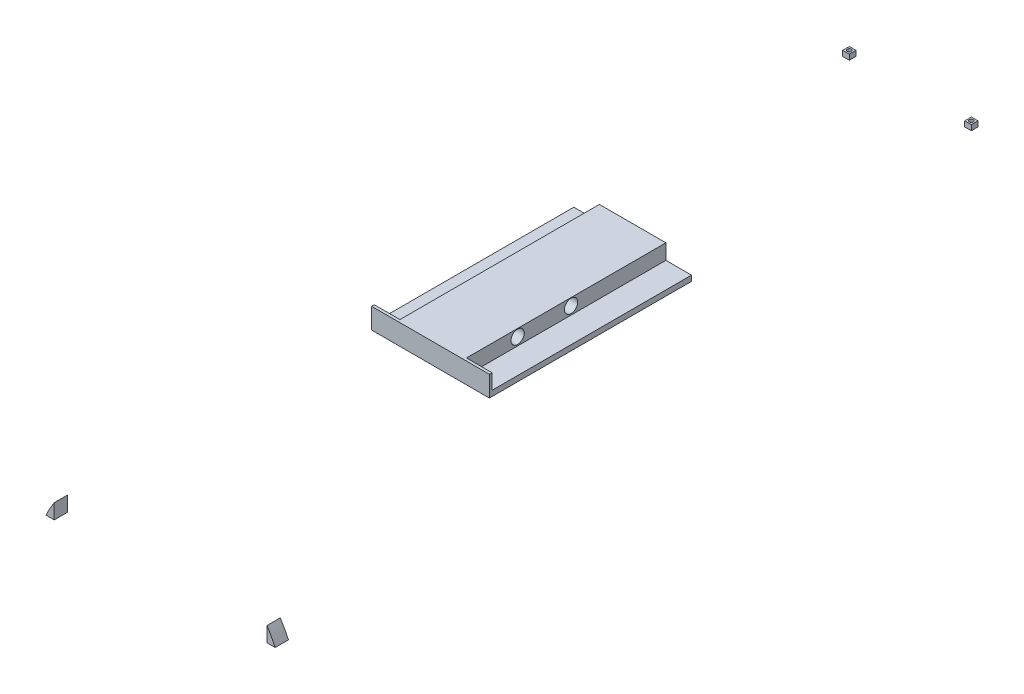
ISO-10303-21;
HEADER;
FILE_DESCRIPTION(('STEP AP214'),'2;1');
FILE_NAME('part.step','',(''),(''),'','','');
FILE_SCHEMA(('AUTOMOTIVE_DESIGN { 1 0 10303 214 1 1 1 1 }'));
ENDSEC;
DATA;
#1=APPLICATION_CONTEXT('core data for automotive mechanical design processes');
#2=APPLICATION_PROTOCOL_DEFINITION('international standard','automotive_design',2000,#1);
#3=PRODUCT_CONTEXT('',#1,'mechanical');
#4=PRODUCT('Part','Part','',(#3));
#5=PRODUCT_RELATED_PRODUCT_CATEGORY('part','',(#4));
#6=PRODUCT_DEFINITION_FORMATION('','',#4);
#7=PRODUCT_DEFINITION_CONTEXT('part definition',#1,'design');
#8=PRODUCT_DEFINITION('design','',#6,#7);
#9=PRODUCT_DEFINITION_SHAPE('','',#8);
#10=(LENGTH_UNIT() NAMED_UNIT(*) SI_UNIT(.MILLI.,.METRE.));
#11=(NAMED_UNIT(*) PLANE_ANGLE_UNIT() SI_UNIT($,.RADIAN.));
#12=(NAMED_UNIT(*) SI_UNIT($,.STERADIAN.) SOLID_ANGLE_UNIT());
#13=UNCERTAINTY_MEASURE_WITH_UNIT(LENGTH_MEASURE(1.E-05),#10,'distance_accuracy_value','');
#14=(GEOMETRIC_REPRESENTATION_CONTEXT(3) GLOBAL_UNCERTAINTY_ASSIGNED_CONTEXT((#13)) GLOBAL_UNIT_ASSIGNED_CONTEXT((#10,
#11,#12)) REPRESENTATION_CONTEXT('',''));
#15=CARTESIAN_POINT('',(0.,0.,0.));
#16=DIRECTION('',(0.,0.,1.));
#17=DIRECTION('',(1.,0.,0.));
#18=AXIS2_PLACEMENT_3D('',#15,#16,#17);
#19=CARTESIAN_POINT('',(-44.2539493265855,95.5,-575.));
#20=DIRECTION('',(1.,0.,0.));
#21=DIRECTION('',(0.,1.,0.));
#22=AXIS2_PLACEMENT_3D('',#19,#20,#21);
#23=PLANE('',#22);
#24=DIRECTION('',(0.,0.,1.));
#25=VECTOR('',#24,1.);
#26=CARTESIAN_POINT('',(-44.2539493265855,95.5,-575.));
#27=LINE('',#26,#25);
#28=CARTESIAN_POINT('',(-44.2539493265855,95.5,-425.));
#29=VERTEX_POINT('',#28);
#30=CARTESIAN_POINT('',(-44.2539493265855,95.5,-423.));
#31=VERTEX_POINT('',#30);
#32=EDGE_CURVE('P0_E184',#29,#31,#27,.T.);
#33=ORIENTED_EDGE('',*,*,#32,.F.);
#34=DIRECTION('',(0.,-1.,0.));
#35=VECTOR('',#34,1.);
#36=CARTESIAN_POINT('',(-44.2539493265855,95.5,-425.));
#37=LINE('',#36,#35);
#38=CARTESIAN_POINT('',(-44.2539493265855,84.063,-425.));
#39=VERTEX_POINT('',#38);
#40=EDGE_CURVE('P0_E72',#29,#39,#37,.T.);
#41=ORIENTED_EDGE('',*,*,#40,.T.);
#42=DIRECTION('',(0.,0.,1.));
#43=VECTOR('',#42,1.);
#44=CARTESIAN_POINT('',(-44.2539493265855,84.063,-575.));
#45=LINE('',#44,#43);
#46=CARTESIAN_POINT('',(-44.2539493265855,84.063,-575.));
#47=VERTEX_POINT('',#46);
#48=EDGE_CURVE('P0_E132',#47,#39,#45,.T.);
#49=ORIENTED_EDGE('',*,*,#48,.F.);
#50=DIRECTION('',(0.,-1.,0.));
#51=VECTOR('',#50,1.);
#52=CARTESIAN_POINT('',(-44.2539493265855,95.5,-575.));
#53=LINE('',#52,#51);
#54=CARTESIAN_POINT('',(-44.2539493265855,80.,-575.));
#55=VERTEX_POINT('',#54);
#56=EDGE_CURVE('P0_E194',#47,#55,#53,.T.);
#57=ORIENTED_EDGE('',*,*,#56,.T.);
#58=DIRECTION('',(0.,0.,-1.));
#59=VECTOR('',#58,1.);
#60=CARTESIAN_POINT('',(-44.2539493265855,80.,-423.));
#61=LINE('',#60,#59);
#62=CARTESIAN_POINT('',(-44.2539493265855,80.,-423.));
#63=VERTEX_POINT('',#62);
#64=EDGE_CURVE('P0_E167',#63,#55,#61,.T.);
#65=ORIENTED_EDGE('',*,*,#64,.F.);
#66=DIRECTION('',(0.,-1.,0.));
#67=VECTOR('',#66,1.);
#68=CARTESIAN_POINT('',(-44.2539493265855,95.5,-423.));
#69=LINE('',#68,#67);
#70=EDGE_CURVE('P0_E181',#31,#63,#69,.T.);
#71=ORIENTED_EDGE('',*,*,#70,.F.);
#72=EDGE_LOOP('',(#33,#41,#49,#57,#65,#71));
#73=FACE_BOUND('',#72,.T.);
#74=ADVANCED_FACE('P0_F48',(#73),#23,.F.);
#75=CARTESIAN_POINT('',(44.2539493265855,95.5,-425.));
#76=DIRECTION('',(-1.,0.,0.));
#77=DIRECTION('',(0.,-1.,0.));
#78=AXIS2_PLACEMENT_3D('',#75,#76,#77);
#79=PLANE('',#78);
#80=DIRECTION('',(0.,0.,-1.));
#81=VECTOR('',#80,1.);
#82=CARTESIAN_POINT('',(44.2539493265855,84.063,-425.));
#83=LINE('',#82,#81);
#84=CARTESIAN_POINT('',(44.2539493265855,84.063,-425.));
#85=VERTEX_POINT('',#84);
#86=CARTESIAN_POINT('',(44.2539493265855,84.063,-575.));
#87=VERTEX_POINT('',#86);
#88=EDGE_CURVE('P0_E164',#85,#87,#83,.T.);
#89=ORIENTED_EDGE('',*,*,#88,.F.);
#90=DIRECTION('',(0.,1.,0.));
#91=VECTOR('',#90,1.);
#92=CARTESIAN_POINT('',(44.2539493265855,95.5,-425.));
#93=LINE('',#92,#91);
#94=CARTESIAN_POINT('',(44.2539493265855,95.5,-425.));
#95=VERTEX_POINT('',#94);
#96=EDGE_CURVE('P0_E149',#85,#95,#93,.T.);
#97=ORIENTED_EDGE('',*,*,#96,.T.);
#98=DIRECTION('',(0.,0.,-1.));
#99=VECTOR('',#98,1.);
#100=CARTESIAN_POINT('',(44.2539493265855,95.5,-425.));
#101=LINE('',#100,#99);
#102=CARTESIAN_POINT('',(44.2539493265855,95.5,-423.));
#103=VERTEX_POINT('',#102);
#104=EDGE_CURVE('P0_E188',#103,#95,#101,.T.);
#105=ORIENTED_EDGE('',*,*,#104,.F.);
#106=DIRECTION('',(0.,-1.,0.));
#107=VECTOR('',#106,1.);
#108=CARTESIAN_POINT('',(44.2539493265855,95.5,-423.));
#109=LINE('',#108,#107);
#110=CARTESIAN_POINT('',(44.2539493265855,80.,-423.));
#111=VERTEX_POINT('',#110);
#112=EDGE_CURVE('P0_E180',#103,#111,#109,.T.);
#113=ORIENTED_EDGE('',*,*,#112,.T.);
#114=DIRECTION('',(0.,0.,1.));
#115=VECTOR('',#114,1.);
#116=CARTESIAN_POINT('',(44.2539493265855,80.,-577.));
#117=LINE('',#116,#115);
#118=CARTESIAN_POINT('',(44.2539493265855,80.,-575.));
#119=VERTEX_POINT('',#118);
#120=EDGE_CURVE('P0_E170',#119,#111,#117,.T.);
#121=ORIENTED_EDGE('',*,*,#120,.F.);
#122=DIRECTION('',(0.,-1.,0.));
#123=VECTOR('',#122,1.);
#124=CARTESIAN_POINT('',(44.2539493265855,95.5,-575.));
#125=LINE('',#124,#123);
#126=EDGE_CURVE('P0_E196',#87,#119,#125,.T.);
#127=ORIENTED_EDGE('',*,*,#126,.F.);
#128=EDGE_LOOP('',(#89,#97,#105,#113,#121,#127));
#129=FACE_BOUND('',#128,.T.);
#130=ADVANCED_FACE('P0_F235',(#129),#79,.F.);
#131=CARTESIAN_POINT('',(-30.,95.5,-575.));
#132=DIRECTION('',(0.,0.,1.));
#133=DIRECTION('',(1.,0.,0.));
#134=AXIS2_PLACEMENT_3D('',#131,#132,#133);
#135=PLANE('',#134);
#136=DIRECTION('',(-1.,0.,0.));
#137=VECTOR('',#136,1.);
#138=CARTESIAN_POINT('',(-25.,84.063,-575.));
#139=LINE('',#138,#137);
#140=CARTESIAN_POINT('',(-25.,84.063,-575.));
#141=VERTEX_POINT('',#140);
#142=EDGE_CURVE('P0_E141',#141,#47,#139,.T.);
#143=ORIENTED_EDGE('',*,*,#142,.F.);
#144=DIRECTION('',(0.,1.,0.));
#145=VECTOR('',#144,1.);
#146=CARTESIAN_POINT('',(-25.,84.063,-575.));
#147=LINE('',#146,#145);
#148=CARTESIAN_POINT('',(-25.,95.5,-575.));
#149=VERTEX_POINT('',#148);
#150=EDGE_CURVE('P0_E140',#141,#149,#147,.T.);
#151=ORIENTED_EDGE('',*,*,#150,.T.);
#152=DIRECTION('',(-1.,0.,0.));
#153=VECTOR('',#152,1.);
#154=CARTESIAN_POINT('',(44.2539493265855,95.5,-575.));
#155=LINE('',#154,#153);
#156=CARTESIAN_POINT('',(25.,95.5,-575.));
#157=VERTEX_POINT('',#156);
#158=EDGE_CURVE('P0_E191',#157,#149,#155,.T.);
#159=ORIENTED_EDGE('',*,*,#158,.F.);
#160=DIRECTION('',(0.,1.,0.));
#161=VECTOR('',#160,1.);
#162=CARTESIAN_POINT('',(25.,84.063,-575.));
#163=LINE('',#162,#161);
#164=CARTESIAN_POINT('',(25.,84.063,-575.));
#165=VERTEX_POINT('',#164);
#166=EDGE_CURVE('P0_E151',#165,#157,#163,.T.);
#167=ORIENTED_EDGE('',*,*,#166,.F.);
#168=DIRECTION('',(-1.,0.,0.));
#169=VECTOR('',#168,1.);
#170=CARTESIAN_POINT('',(60.,84.063,-575.));
#171=LINE('',#170,#169);
#172=EDGE_CURVE('P0_E157',#87,#165,#171,.T.);
#173=ORIENTED_EDGE('',*,*,#172,.F.);
#174=ORIENTED_EDGE('',*,*,#126,.T.);
#175=DIRECTION('',(1.,0.,0.));
#176=VECTOR('',#175,1.);
#177=CARTESIAN_POINT('',(-30.,80.,-575.));
#178=LINE('',#177,#176);
#179=EDGE_CURVE('P0_E174',#55,#119,#178,.T.);
#180=ORIENTED_EDGE('',*,*,#179,.F.);
#181=ORIENTED_EDGE('',*,*,#56,.F.);
#182=EDGE_LOOP('',(#143,#151,#159,#167,#173,#174,#180,#181));
#183=FACE_BOUND('',#182,.T.);
#184=ADVANCED_FACE('P0_F243',(#183),#135,.F.);
#185=CARTESIAN_POINT('',(44.2539493265855,95.5,-423.));
#186=DIRECTION('',(0.,0.,1.));
#187=DIRECTION('',(1.,0.,0.));
#188=AXIS2_PLACEMENT_3D('',#185,#186,#187);
#189=PLANE('',#188);
#190=ORIENTED_EDGE('',*,*,#70,.T.);
#191=DIRECTION('',(-1.,0.,0.));
#192=VECTOR('',#191,1.);
#193=CARTESIAN_POINT('',(44.2539493265855,80.,-423.));
#194=LINE('',#193,#192);
#195=EDGE_CURVE('P0_E172',#111,#63,#194,.T.);
#196=ORIENTED_EDGE('',*,*,#195,.F.);
#197=ORIENTED_EDGE('',*,*,#112,.F.);
#198=DIRECTION('',(-1.,0.,0.));
#199=VECTOR('',#198,1.);
#200=CARTESIAN_POINT('',(44.2539493265855,95.5,-423.));
#201=LINE('',#200,#199);
#202=EDGE_CURVE('P0_E177',#103,#31,#201,.T.);
#203=ORIENTED_EDGE('',*,*,#202,.T.);
#204=EDGE_LOOP('',(#190,#196,#197,#203));
#205=FACE_BOUND('',#204,.T.);
#206=ADVANCED_FACE('P0_F251',(#205),#189,.T.);
#207=CARTESIAN_POINT('',(0.,95.5,0.));
#208=DIRECTION('',(0.,1.,0.));
#209=DIRECTION('',(0.,0.,1.));
#210=AXIS2_PLACEMENT_3D('',#207,#208,#209);
#211=PLANE('',#210);
#212=DIRECTION('',(0.,0.,-1.));
#213=VECTOR('',#212,1.);
#214=CARTESIAN_POINT('',(-25.,95.5,0.));
#215=LINE('',#214,#213);
#216=CARTESIAN_POINT('',(-25.,95.5,-425.));
#217=VERTEX_POINT('',#216);
#218=EDGE_CURVE('P0_E12',#217,#149,#215,.T.);
#219=ORIENTED_EDGE('',*,*,#218,.F.);
#220=DIRECTION('',(1.,0.,0.));
#221=VECTOR('',#220,1.);
#222=CARTESIAN_POINT('',(0.,95.5,-425.));
#223=LINE('',#222,#221);
#224=EDGE_CURVE('P0_E56',#29,#217,#223,.T.);
#225=ORIENTED_EDGE('',*,*,#224,.F.);
#226=ORIENTED_EDGE('',*,*,#32,.T.);
#227=ORIENTED_EDGE('',*,*,#202,.F.);
#228=ORIENTED_EDGE('',*,*,#104,.T.);
#229=DIRECTION('',(1.,0.,0.));
#230=VECTOR('',#229,1.);
#231=CARTESIAN_POINT('',(0.,95.5,-425.));
#232=LINE('',#231,#230);
#233=CARTESIAN_POINT('',(25.,95.5,-425.));
#234=VERTEX_POINT('',#233);
#235=EDGE_CURVE('P0_E198',#234,#95,#232,.T.);
#236=ORIENTED_EDGE('',*,*,#235,.F.);
#237=DIRECTION('',(0.,0.,1.));
#238=VECTOR('',#237,1.);
#239=CARTESIAN_POINT('',(25.,95.5,0.));
#240=LINE('',#239,#238);
#241=EDGE_CURVE('P0_E200',#157,#234,#240,.T.);
#242=ORIENTED_EDGE('',*,*,#241,.F.);
#243=ORIENTED_EDGE('',*,*,#158,.T.);
#244=EDGE_LOOP('',(#219,#225,#226,#227,#228,#236,#242,#243));
#245=FACE_BOUND('',#244,.T.);
#246=ADVANCED_FACE('P0_F231',(#245),#211,.T.);
#247=CARTESIAN_POINT('',(0.,80.,0.));
#248=DIRECTION('',(0.,-1.,0.));
#249=DIRECTION('',(0.,0.,-1.));
#250=AXIS2_PLACEMENT_3D('',#247,#248,#249);
#251=PLANE('',#250);
#252=ORIENTED_EDGE('',*,*,#179,.T.);
#253=ORIENTED_EDGE('',*,*,#120,.T.);
#254=ORIENTED_EDGE('',*,*,#195,.T.);
#255=ORIENTED_EDGE('',*,*,#64,.T.);
#256=EDGE_LOOP('',(#252,#253,#254,#255));
#257=FACE_BOUND('',#256,.T.);
#258=ADVANCED_FACE('P0_F253',(#257),#251,.T.);
#259=CARTESIAN_POINT('',(0.,84.063,0.));
#260=DIRECTION('',(0.,1.,0.));
#261=DIRECTION('',(0.,0.,1.));
#262=AXIS2_PLACEMENT_3D('',#259,#260,#261);
#263=PLANE('',#262);
#264=ORIENTED_EDGE('',*,*,#88,.T.);
#265=ORIENTED_EDGE('',*,*,#172,.T.);
#266=DIRECTION('',(0.,0.,1.));
#267=VECTOR('',#266,1.);
#268=CARTESIAN_POINT('',(25.,84.063,-575.));
#269=LINE('',#268,#267);
#270=CARTESIAN_POINT('',(25.,84.063,-425.));
#271=VERTEX_POINT('',#270);
#272=EDGE_CURVE('P0_E153',#165,#271,#269,.T.);
#273=ORIENTED_EDGE('',*,*,#272,.T.);
#274=DIRECTION('',(1.,0.,0.));
#275=VECTOR('',#274,1.);
#276=CARTESIAN_POINT('',(25.,84.063,-425.));
#277=LINE('',#276,#275);
#278=EDGE_CURVE('P0_E133',#271,#85,#277,.T.);
#279=ORIENTED_EDGE('',*,*,#278,.T.);
#280=EDGE_LOOP('',(#264,#265,#273,#279));
#281=FACE_BOUND('',#280,.T.);
#282=ADVANCED_FACE('P0_F241',(#281),#263,.T.);
#283=CARTESIAN_POINT('',(44.2539493265855,84.063,-425.));
#284=DIRECTION('',(0.,0.,1.));
#285=DIRECTION('',(1.,0.,0.));
#286=AXIS2_PLACEMENT_3D('',#283,#284,#285);
#287=PLANE('',#286);
#288=ORIENTED_EDGE('',*,*,#278,.F.);
#289=DIRECTION('',(0.,1.,0.));
#290=VECTOR('',#289,1.);
#291=CARTESIAN_POINT('',(25.,84.063,-425.));
#292=LINE('',#291,#290);
#293=EDGE_CURVE('P0_E64',#271,#234,#292,.T.);
#294=ORIENTED_EDGE('',*,*,#293,.T.);
#295=ORIENTED_EDGE('',*,*,#235,.T.);
#296=ORIENTED_EDGE('',*,*,#96,.F.);
#297=EDGE_LOOP('',(#288,#294,#295,#296));
#298=FACE_BOUND('',#297,.T.);
#299=ADVANCED_FACE('P0_F222',(#298),#287,.F.);
#300=CARTESIAN_POINT('',(25.,84.063,-575.));
#301=DIRECTION('',(-1.,0.,0.));
#302=DIRECTION('',(0.,-1.,0.));
#303=AXIS2_PLACEMENT_3D('',#300,#301,#302);
#304=PLANE('',#303);
#305=CARTESIAN_POINT('',(25.,90.063,-503.700854972493));
#306=DIRECTION('',(1.,0.,0.));
#307=DIRECTION('',(0.,1.,0.));
#308=AXIS2_PLACEMENT_3D('',#305,#306,#307);
#309=CIRCLE('',#308,5.);
#310=CARTESIAN_POINT('',(25.,95.063,-503.700854972493));
#311=VERTEX_POINT('',#310);
#312=EDGE_CURVE('P0_E204',#311,#311,#309,.T.);
#313=ORIENTED_EDGE('',*,*,#312,.F.);
#314=EDGE_LOOP('',(#313));
#315=FACE_BOUND('',#314,.T.);
#316=CARTESIAN_POINT('',(25.,90.063,-463.500824114449));
#317=DIRECTION('',(1.,0.,0.));
#318=DIRECTION('',(0.,1.,0.));
#319=AXIS2_PLACEMENT_3D('',#316,#317,#318);
#320=CIRCLE('',#319,5.);
#321=CARTESIAN_POINT('',(25.,95.063,-463.500824114449));
#322=VERTEX_POINT('',#321);
#323=EDGE_CURVE('P0_E209',#322,#322,#320,.T.);
#324=ORIENTED_EDGE('',*,*,#323,.F.);
#325=EDGE_LOOP('',(#324));
#326=FACE_BOUND('',#325,.T.);
#327=ORIENTED_EDGE('',*,*,#241,.T.);
#328=ORIENTED_EDGE('',*,*,#293,.F.);
#329=ORIENTED_EDGE('',*,*,#272,.F.);
#330=ORIENTED_EDGE('',*,*,#166,.T.);
#331=EDGE_LOOP('',(#327,#328,#329,#330));
#332=FACE_BOUND('',#331,.T.);
#333=ADVANCED_FACE('P0_F219',(#315,#326,#332),#304,.F.);
#334=CARTESIAN_POINT('',(0.,84.063,0.));
#335=DIRECTION('',(0.,1.,0.));
#336=DIRECTION('',(0.,0.,1.));
#337=AXIS2_PLACEMENT_3D('',#334,#335,#336);
#338=PLANE('',#337);
#339=ORIENTED_EDGE('',*,*,#48,.T.);
#340=DIRECTION('',(1.,0.,0.));
#341=VECTOR('',#340,1.);
#342=CARTESIAN_POINT('',(-60.,84.063,-425.));
#343=LINE('',#342,#341);
#344=CARTESIAN_POINT('',(-25.,84.063,-425.));
#345=VERTEX_POINT('',#344);
#346=EDGE_CURVE('P0_E125',#39,#345,#343,.T.);
#347=ORIENTED_EDGE('',*,*,#346,.T.);
#348=DIRECTION('',(0.,0.,-1.));
#349=VECTOR('',#348,1.);
#350=CARTESIAN_POINT('',(-25.,84.063,-425.));
#351=LINE('',#350,#349);
#352=EDGE_CURVE('P0_E129',#345,#141,#351,.T.);
#353=ORIENTED_EDGE('',*,*,#352,.T.);
#354=ORIENTED_EDGE('',*,*,#142,.T.);
#355=EDGE_LOOP('',(#339,#347,#353,#354));
#356=FACE_BOUND('',#355,.T.);
#357=ADVANCED_FACE('P0_F127',(#356),#338,.T.);
#358=CARTESIAN_POINT('',(-30.,84.063,-425.));
#359=DIRECTION('',(0.,0.,1.));
#360=DIRECTION('',(1.,0.,0.));
#361=AXIS2_PLACEMENT_3D('',#358,#359,#360);
#362=PLANE('',#361);
#363=ORIENTED_EDGE('',*,*,#224,.T.);
#364=DIRECTION('',(0.,1.,0.));
#365=VECTOR('',#364,1.);
#366=CARTESIAN_POINT('',(-25.,84.063,-425.));
#367=LINE('',#366,#365);
#368=EDGE_CURVE('P0_E136',#345,#217,#367,.T.);
#369=ORIENTED_EDGE('',*,*,#368,.F.);
#370=ORIENTED_EDGE('',*,*,#346,.F.);
#371=ORIENTED_EDGE('',*,*,#40,.F.);
#372=EDGE_LOOP('',(#363,#369,#370,#371));
#373=FACE_BOUND('',#372,.T.);
#374=ADVANCED_FACE('P0_F137',(#373),#362,.F.);
#375=CARTESIAN_POINT('',(-25.,84.063,-425.));
#376=DIRECTION('',(1.,0.,0.));
#377=DIRECTION('',(0.,1.,0.));
#378=AXIS2_PLACEMENT_3D('',#375,#376,#377);
#379=PLANE('',#378);
#380=CARTESIAN_POINT('',(-25.,90.063,-503.700854972493));
#381=DIRECTION('',(1.,0.,0.));
#382=DIRECTION('',(0.,1.,0.));
#383=AXIS2_PLACEMENT_3D('',#380,#381,#382);
#384=CIRCLE('',#383,5.);
#385=CARTESIAN_POINT('',(-25.,95.063,-503.700854972493));
#386=VERTEX_POINT('',#385);
#387=EDGE_CURVE('P0_E51',#386,#386,#384,.T.);
#388=ORIENTED_EDGE('',*,*,#387,.T.);
#389=EDGE_LOOP('',(#388));
#390=FACE_BOUND('',#389,.T.);
#391=CARTESIAN_POINT('',(-25.,90.063,-463.500824114449));
#392=DIRECTION('',(1.,0.,0.));
#393=DIRECTION('',(0.,1.,0.));
#394=AXIS2_PLACEMENT_3D('',#391,#392,#393);
#395=CIRCLE('',#394,5.);
#396=CARTESIAN_POINT('',(-25.,95.063,-463.500824114449));
#397=VERTEX_POINT('',#396);
#398=EDGE_CURVE('P0_E202',#397,#397,#395,.T.);
#399=ORIENTED_EDGE('',*,*,#398,.T.);
#400=EDGE_LOOP('',(#399));
#401=FACE_BOUND('',#400,.T.);
#402=ORIENTED_EDGE('',*,*,#218,.T.);
#403=ORIENTED_EDGE('',*,*,#150,.F.);
#404=ORIENTED_EDGE('',*,*,#352,.F.);
#405=ORIENTED_EDGE('',*,*,#368,.T.);
#406=EDGE_LOOP('',(#402,#403,#404,#405));
#407=FACE_BOUND('',#406,.T.);
#408=ADVANCED_FACE('P0_F143',(#390,#401,#407),#379,.F.);
#409=CARTESIAN_POINT('',(-86.1684396980704,90.063,-463.500824114449));
#410=DIRECTION('',(1.,0.,0.));
#411=DIRECTION('',(0.,1.,0.));
#412=AXIS2_PLACEMENT_3D('',#409,#410,#411);
#413=CYLINDRICAL_SURFACE('',#412,5.);
#414=ORIENTED_EDGE('',*,*,#323,.T.);
#415=EDGE_LOOP('',(#414));
#416=FACE_BOUND('',#415,.T.);
#417=ORIENTED_EDGE('',*,*,#398,.F.);
#418=EDGE_LOOP('',(#417));
#419=FACE_BOUND('',#418,.T.);
#420=ADVANCED_FACE('P0_F216',(#416,#419),#413,.F.);
#421=CARTESIAN_POINT('',(-86.1684396980704,90.063,-503.700854972493));
#422=DIRECTION('',(1.,0.,0.));
#423=DIRECTION('',(0.,1.,0.));
#424=AXIS2_PLACEMENT_3D('',#421,#422,#423);
#425=CYLINDRICAL_SURFACE('',#424,5.);
#426=ORIENTED_EDGE('',*,*,#312,.T.);
#427=EDGE_LOOP('',(#426));
#428=FACE_BOUND('',#427,.T.);
#429=ORIENTED_EDGE('',*,*,#387,.F.);
#430=EDGE_LOOP('',(#429));
#431=FACE_BOUND('',#430,.T.);
#432=ADVANCED_FACE('P0_F343',(#428,#431),#425,.F.);
#433=CLOSED_SHELL('',(#74,#130,#184,#206,#246,#258,#282,#299,#333,#357,#374,#408,#420,#432));
#434=MANIFOLD_SOLID_BREP('P0_B2',#433);
#435=CARTESIAN_POINT('',(48.4063060876568,81.,-781.306302338996));
#436=DIRECTION('',(-1.,0.,0.));
#437=DIRECTION('',(0.,-1.,0.));
#438=AXIS2_PLACEMENT_3D('',#435,#436,#437);
#439=PLANE('',#438);
#440=DIRECTION('',(0.,0.,-1.));
#441=VECTOR('',#440,1.);
#442=CARTESIAN_POINT('',(48.4063060876568,77.,-781.306302338996));
#443=LINE('',#442,#441);
#444=CARTESIAN_POINT('',(48.4063060876568,77.,-781.306302338996));
#445=VERTEX_POINT('',#444);
#446=CARTESIAN_POINT('',(48.4063060876568,77.,-786.306302338996));
#447=VERTEX_POINT('',#446);
#448=EDGE_CURVE('P0_E46',#445,#447,#443,.T.);
#449=ORIENTED_EDGE('',*,*,#448,.T.);
#450=DIRECTION('',(0.,-1.,0.));
#451=VECTOR('',#450,1.);
#452=CARTESIAN_POINT('',(48.4063060876568,81.,-786.306302338996));
#453=LINE('',#452,#451);
#454=CARTESIAN_POINT('',(48.4063060876568,81.,-786.306302338996));
#455=VERTEX_POINT('',#454);
#456=EDGE_CURVE('P0_E481',#455,#447,#453,.T.);
#457=ORIENTED_EDGE('',*,*,#456,.F.);
#458=DIRECTION('',(0.,0.,-1.));
#459=VECTOR('',#458,1.);
#460=CARTESIAN_POINT('',(48.4063060876568,81.,-781.306302338996));
#461=LINE('',#460,#459);
#462=CARTESIAN_POINT('',(48.4063060876568,81.,-781.306302338996));
#463=VERTEX_POINT('',#462);
#464=EDGE_CURVE('P0_E470',#463,#455,#461,.T.);
#465=ORIENTED_EDGE('',*,*,#464,.F.);
#466=DIRECTION('',(0.,-1.,0.));
#467=VECTOR('',#466,1.);
#468=CARTESIAN_POINT('',(48.4063060876568,81.,-781.306302338996));
#469=LINE('',#468,#467);
#470=EDGE_CURVE('P0_E467',#463,#445,#469,.T.);
#471=ORIENTED_EDGE('',*,*,#470,.T.);
#472=EDGE_LOOP('',(#449,#457,#465,#471));
#473=FACE_BOUND('',#472,.T.);
#474=ADVANCED_FACE('P0_F408',(#473),#439,.F.);
#475=CARTESIAN_POINT('',(48.4063060876568,81.,-786.306302338996));
#476=DIRECTION('',(0.,0.,1.));
#477=DIRECTION('',(1.,0.,0.));
#478=AXIS2_PLACEMENT_3D('',#475,#476,#477);
#479=PLANE('',#478);
#480=DIRECTION('',(-1.,0.,0.));
#481=VECTOR('',#480,1.);
#482=CARTESIAN_POINT('',(48.4063060876568,77.,-786.306302338996));
#483=LINE('',#482,#481);
#484=CARTESIAN_POINT('',(43.4063060876568,77.,-786.306302338996));
#485=VERTEX_POINT('',#484);
#486=EDGE_CURVE('P0_E418',#447,#485,#483,.T.);
#487=ORIENTED_EDGE('',*,*,#486,.T.);
#488=DIRECTION('',(0.,-1.,0.));
#489=VECTOR('',#488,1.);
#490=CARTESIAN_POINT('',(43.4063060876568,81.,-786.306302338996));
#491=LINE('',#490,#489);
#492=CARTESIAN_POINT('',(43.4063060876568,81.,-786.306302338996));
#493=VERTEX_POINT('',#492);
#494=EDGE_CURVE('P0_E463',#493,#485,#491,.T.);
#495=ORIENTED_EDGE('',*,*,#494,.F.);
#496=DIRECTION('',(-1.,0.,0.));
#497=VECTOR('',#496,1.);
#498=CARTESIAN_POINT('',(48.4063060876568,81.,-786.306302338996));
#499=LINE('',#498,#497);
#500=EDGE_CURVE('P0_E442',#455,#493,#499,.T.);
#501=ORIENTED_EDGE('',*,*,#500,.F.);
#502=ORIENTED_EDGE('',*,*,#456,.T.);
#503=EDGE_LOOP('',(#487,#495,#501,#502));
#504=FACE_BOUND('',#503,.T.);
#505=ADVANCED_FACE('P0_F503',(#504),#479,.F.);
#506=CARTESIAN_POINT('',(43.4063060876568,81.,-786.306302338996));
#507=DIRECTION('',(1.,0.,0.));
#508=DIRECTION('',(0.,1.,0.));
#509=AXIS2_PLACEMENT_3D('',#506,#507,#508);
#510=PLANE('',#509);
#511=DIRECTION('',(0.,0.,1.));
#512=VECTOR('',#511,1.);
#513=CARTESIAN_POINT('',(43.4063060876568,77.,-786.306302338996));
#514=LINE('',#513,#512);
#515=CARTESIAN_POINT('',(43.4063060876568,77.,-781.306302338996));
#516=VERTEX_POINT('',#515);
#517=EDGE_CURVE('P0_E458',#485,#516,#514,.T.);
#518=ORIENTED_EDGE('',*,*,#517,.T.);
#519=DIRECTION('',(0.,-1.,0.));
#520=VECTOR('',#519,1.);
#521=CARTESIAN_POINT('',(43.4063060876568,81.,-781.306302338996));
#522=LINE('',#521,#520);
#523=CARTESIAN_POINT('',(43.4063060876568,81.,-781.306302338996));
#524=VERTEX_POINT('',#523);
#525=EDGE_CURVE('P0_E461',#524,#516,#522,.T.);
#526=ORIENTED_EDGE('',*,*,#525,.F.);
#527=DIRECTION('',(0.,0.,1.));
#528=VECTOR('',#527,1.);
#529=CARTESIAN_POINT('',(43.4063060876568,81.,-786.306302338996));
#530=LINE('',#529,#528);
#531=EDGE_CURVE('P0_E476',#493,#524,#530,.T.);
#532=ORIENTED_EDGE('',*,*,#531,.F.);
#533=ORIENTED_EDGE('',*,*,#494,.T.);
#534=EDGE_LOOP('',(#518,#526,#532,#533));
#535=FACE_BOUND('',#534,.T.);
#536=ADVANCED_FACE('P0_F459',(#535),#510,.F.);
#537=CARTESIAN_POINT('',(43.4063060876568,81.,-781.306302338996));
#538=DIRECTION('',(0.,0.,-1.));
#539=DIRECTION('',(-1.,0.,0.));
#540=AXIS2_PLACEMENT_3D('',#537,#538,#539);
#541=PLANE('',#540);
#542=DIRECTION('',(1.,0.,0.));
#543=VECTOR('',#542,1.);
#544=CARTESIAN_POINT('',(43.4063060876568,77.,-781.306302338996));
#545=LINE('',#544,#543);
#546=EDGE_CURVE('P0_E452',#516,#445,#545,.T.);
#547=ORIENTED_EDGE('',*,*,#546,.T.);
#548=ORIENTED_EDGE('',*,*,#470,.F.);
#549=DIRECTION('',(1.,0.,0.));
#550=VECTOR('',#549,1.);
#551=CARTESIAN_POINT('',(43.4063060876568,81.,-781.306302338996));
#552=LINE('',#551,#550);
#553=EDGE_CURVE('P0_E466',#524,#463,#552,.T.);
#554=ORIENTED_EDGE('',*,*,#553,.F.);
#555=ORIENTED_EDGE('',*,*,#525,.T.);
#556=EDGE_LOOP('',(#547,#548,#554,#555));
#557=FACE_BOUND('',#556,.T.);
#558=ADVANCED_FACE('P0_F465',(#557),#541,.F.);
#559=CARTESIAN_POINT('',(0.,81.,0.));
#560=DIRECTION('',(0.,1.,0.));
#561=DIRECTION('',(0.,0.,1.));
#562=AXIS2_PLACEMENT_3D('',#559,#560,#561);
#563=PLANE('',#562);
#564=CARTESIAN_POINT('',(45.9063060876568,81.,-783.806302338996));
#565=DIRECTION('',(0.,-1.,0.));
#566=DIRECTION('',(0.,0.,-1.));
#567=AXIS2_PLACEMENT_3D('',#564,#565,#566);
#568=CIRCLE('',#567,1.49999999999998);
#569=CARTESIAN_POINT('',(45.9063060876568,81.,-785.306302338996));
#570=VERTEX_POINT('',#569);
#571=EDGE_CURVE('P0_E485',#570,#570,#568,.T.);
#572=ORIENTED_EDGE('',*,*,#571,.T.);
#573=EDGE_LOOP('',(#572));
#574=FACE_BOUND('',#573,.T.);
#575=ORIENTED_EDGE('',*,*,#464,.T.);
#576=ORIENTED_EDGE('',*,*,#500,.T.);
#577=ORIENTED_EDGE('',*,*,#531,.T.);
#578=ORIENTED_EDGE('',*,*,#553,.T.);
#579=EDGE_LOOP('',(#575,#576,#577,#578));
#580=FACE_BOUND('',#579,.T.);
#581=ADVANCED_FACE('P0_F410',(#574,#580),#563,.T.);
#582=CARTESIAN_POINT('',(0.,77.,0.));
#583=DIRECTION('',(0.,1.,0.));
#584=DIRECTION('',(0.,0.,1.));
#585=AXIS2_PLACEMENT_3D('',#582,#583,#584);
#586=PLANE('',#585);
#587=CARTESIAN_POINT('',(45.9063060876568,77.,-783.806302338996));
#588=DIRECTION('',(0.,1.,0.));
#589=DIRECTION('',(0.,0.,1.));
#590=AXIS2_PLACEMENT_3D('',#587,#588,#589);
#591=CIRCLE('',#590,1.49999999999998);
#592=CARTESIAN_POINT('',(45.9063060876568,77.,-782.306302338996));
#593=VERTEX_POINT('',#592);
#594=EDGE_CURVE('P0_E412',#593,#593,#591,.T.);
#595=ORIENTED_EDGE('',*,*,#594,.T.);
#596=EDGE_LOOP('',(#595));
#597=FACE_BOUND('',#596,.T.);
#598=ORIENTED_EDGE('',*,*,#448,.F.);
#599=ORIENTED_EDGE('',*,*,#546,.F.);
#600=ORIENTED_EDGE('',*,*,#517,.F.);
#601=ORIENTED_EDGE('',*,*,#486,.F.);
#602=EDGE_LOOP('',(#598,#599,#600,#601));
#603=FACE_BOUND('',#602,.T.);
#604=ADVANCED_FACE('P0_F469',(#597,#603),#586,.F.);
#605=CARTESIAN_POINT('',(45.9063060876568,81.,-783.806302338996));
#606=DIRECTION('',(0.,-1.,0.));
#607=DIRECTION('',(0.,0.,-1.));
#608=AXIS2_PLACEMENT_3D('',#605,#606,#607);
#609=CYLINDRICAL_SURFACE('',#608,1.49999999999998);
#610=ORIENTED_EDGE('',*,*,#571,.F.);
#611=EDGE_LOOP('',(#610));
#612=FACE_BOUND('',#611,.T.);
#613=ORIENTED_EDGE('',*,*,#594,.F.);
#614=EDGE_LOOP('',(#613));
#615=FACE_BOUND('',#614,.T.);
#616=ADVANCED_FACE('P0_F491',(#612,#615),#609,.F.);
#617=CLOSED_SHELL('',(#474,#505,#536,#558,#581,#604,#616));
#618=MANIFOLD_SOLID_BREP('P0_B6',#617);
#619=CARTESIAN_POINT('',(-43.4063060876568,81.,-781.306302338996));
#620=DIRECTION('',(-1.,0.,0.));
#621=DIRECTION('',(0.,-1.,0.));
#622=AXIS2_PLACEMENT_3D('',#619,#620,#621);
#623=PLANE('',#622);
#624=DIRECTION('',(0.,0.,-1.));
#625=VECTOR('',#624,1.);
#626=CARTESIAN_POINT('',(-43.4063060876568,77.,-781.306302338996));
#627=LINE('',#626,#625);
#628=CARTESIAN_POINT('',(-43.4063060876568,77.,-781.306302338996));
#629=VERTEX_POINT('',#628);
#630=CARTESIAN_POINT('',(-43.4063060876568,77.,-786.306302338996));
#631=VERTEX_POINT('',#630);
#632=EDGE_CURVE('P0_E618',#629,#631,#627,.T.);
#633=ORIENTED_EDGE('',*,*,#632,.T.);
#634=DIRECTION('',(0.,-1.,0.));
#635=VECTOR('',#634,1.);
#636=CARTESIAN_POINT('',(-43.4063060876568,81.,-786.306302338996));
#637=LINE('',#636,#635);
#638=CARTESIAN_POINT('',(-43.4063060876568,81.,-786.306302338996));
#639=VERTEX_POINT('',#638);
#640=EDGE_CURVE('P0_E406',#639,#631,#637,.T.);
#641=ORIENTED_EDGE('',*,*,#640,.F.);
#642=DIRECTION('',(0.,0.,-1.));
#643=VECTOR('',#642,1.);
#644=CARTESIAN_POINT('',(-43.4063060876568,81.,-781.306302338996));
#645=LINE('',#644,#643);
#646=CARTESIAN_POINT('',(-43.4063060876568,81.,-781.306302338996));
#647=VERTEX_POINT('',#646);
#648=EDGE_CURVE('P0_E605',#647,#639,#645,.T.);
#649=ORIENTED_EDGE('',*,*,#648,.F.);
#650=DIRECTION('',(0.,-1.,0.));
#651=VECTOR('',#650,1.);
#652=CARTESIAN_POINT('',(-43.4063060876568,81.,-781.306302338996));
#653=LINE('',#652,#651);
#654=EDGE_CURVE('P0_E614',#647,#629,#653,.T.);
#655=ORIENTED_EDGE('',*,*,#654,.T.);
#656=EDGE_LOOP('',(#633,#641,#649,#655));
#657=FACE_BOUND('',#656,.T.);
#658=ADVANCED_FACE('P0_F553',(#657),#623,.F.);
#659=CARTESIAN_POINT('',(-43.4063060876568,81.,-786.306302338996));
#660=DIRECTION('',(0.,0.,1.));
#661=DIRECTION('',(1.,0.,0.));
#662=AXIS2_PLACEMENT_3D('',#659,#660,#661);
#663=PLANE('',#662);
#664=DIRECTION('',(-1.,0.,0.));
#665=VECTOR('',#664,1.);
#666=CARTESIAN_POINT('',(-43.4063060876568,77.,-786.306302338996));
#667=LINE('',#666,#665);
#668=CARTESIAN_POINT('',(-48.4063060876568,77.,-786.306302338996));
#669=VERTEX_POINT('',#668);
#670=EDGE_CURVE('P0_E609',#631,#669,#667,.T.);
#671=ORIENTED_EDGE('',*,*,#670,.T.);
#672=DIRECTION('',(0.,-1.,0.));
#673=VECTOR('',#672,1.);
#674=CARTESIAN_POINT('',(-48.4063060876568,81.,-786.306302338996));
#675=LINE('',#674,#673);
#676=CARTESIAN_POINT('',(-48.4063060876568,81.,-786.306302338996));
#677=VERTEX_POINT('',#676);
#678=EDGE_CURVE('P0_E562',#677,#669,#675,.T.);
#679=ORIENTED_EDGE('',*,*,#678,.F.);
#680=DIRECTION('',(-1.,0.,0.));
#681=VECTOR('',#680,1.);
#682=CARTESIAN_POINT('',(-43.4063060876568,81.,-786.306302338996));
#683=LINE('',#682,#681);
#684=EDGE_CURVE('P0_E600',#639,#677,#683,.T.);
#685=ORIENTED_EDGE('',*,*,#684,.F.);
#686=ORIENTED_EDGE('',*,*,#640,.T.);
#687=EDGE_LOOP('',(#671,#679,#685,#686));
#688=FACE_BOUND('',#687,.T.);
#689=ADVANCED_FACE('P0_F608',(#688),#663,.F.);
#690=CARTESIAN_POINT('',(-48.4063060876568,81.,-786.306302338996));
#691=DIRECTION('',(1.,0.,0.));
#692=DIRECTION('',(0.,1.,0.));
#693=AXIS2_PLACEMENT_3D('',#690,#691,#692);
#694=PLANE('',#693);
#695=DIRECTION('',(0.,0.,1.));
#696=VECTOR('',#695,1.);
#697=CARTESIAN_POINT('',(-48.4063060876568,77.,-786.306302338996));
#698=LINE('',#697,#696);
#699=CARTESIAN_POINT('',(-48.4063060876568,77.,-781.306302338996));
#700=VERTEX_POINT('',#699);
#701=EDGE_CURVE('P0_E587',#669,#700,#698,.T.);
#702=ORIENTED_EDGE('',*,*,#701,.T.);
#703=DIRECTION('',(0.,-1.,0.));
#704=VECTOR('',#703,1.);
#705=CARTESIAN_POINT('',(-48.4063060876568,81.,-781.306302338996));
#706=LINE('',#705,#704);
#707=CARTESIAN_POINT('',(-48.4063060876568,81.,-781.306302338996));
#708=VERTEX_POINT('',#707);
#709=EDGE_CURVE('P0_E610',#708,#700,#706,.T.);
#710=ORIENTED_EDGE('',*,*,#709,.F.);
#711=DIRECTION('',(0.,0.,1.));
#712=VECTOR('',#711,1.);
#713=CARTESIAN_POINT('',(-48.4063060876568,81.,-786.306302338996));
#714=LINE('',#713,#712);
#715=EDGE_CURVE('P0_E603',#677,#708,#714,.T.);
#716=ORIENTED_EDGE('',*,*,#715,.F.);
#717=ORIENTED_EDGE('',*,*,#678,.T.);
#718=EDGE_LOOP('',(#702,#710,#716,#717));
#719=FACE_BOUND('',#718,.T.);
#720=ADVANCED_FACE('P0_F612',(#719),#694,.F.);
#721=CARTESIAN_POINT('',(-48.4063060876568,81.,-781.306302338996));
#722=DIRECTION('',(0.,0.,-1.));
#723=DIRECTION('',(-1.,0.,0.));
#724=AXIS2_PLACEMENT_3D('',#721,#722,#723);
#725=PLANE('',#724);
#726=DIRECTION('',(1.,0.,0.));
#727=VECTOR('',#726,1.);
#728=CARTESIAN_POINT('',(-48.4063060876568,77.,-781.306302338996));
#729=LINE('',#728,#727);
#730=EDGE_CURVE('P0_E593',#700,#629,#729,.T.);
#731=ORIENTED_EDGE('',*,*,#730,.T.);
#732=ORIENTED_EDGE('',*,*,#654,.F.);
#733=DIRECTION('',(1.,0.,0.));
#734=VECTOR('',#733,1.);
#735=CARTESIAN_POINT('',(-48.4063060876568,81.,-781.306302338996));
#736=LINE('',#735,#734);
#737=EDGE_CURVE('P0_E570',#708,#647,#736,.T.);
#738=ORIENTED_EDGE('',*,*,#737,.F.);
#739=ORIENTED_EDGE('',*,*,#709,.T.);
#740=EDGE_LOOP('',(#731,#732,#738,#739));
#741=FACE_BOUND('',#740,.T.);
#742=ADVANCED_FACE('P0_F625',(#741),#725,.F.);
#743=CARTESIAN_POINT('',(0.,81.,0.));
#744=DIRECTION('',(0.,1.,0.));
#745=DIRECTION('',(0.,0.,1.));
#746=AXIS2_PLACEMENT_3D('',#743,#744,#745);
#747=PLANE('',#746);
#748=CARTESIAN_POINT('',(-45.9063060876568,81.,-783.806302338996));
#749=DIRECTION('',(0.,-1.,0.));
#750=DIRECTION('',(0.,0.,-1.));
#751=AXIS2_PLACEMENT_3D('',#748,#749,#750);
#752=CIRCLE('',#751,1.49999999999997);
#753=CARTESIAN_POINT('',(-45.9063060876568,81.,-785.306302338996));
#754=VERTEX_POINT('',#753);
#755=EDGE_CURVE('P0_E631',#754,#754,#752,.T.);
#756=ORIENTED_EDGE('',*,*,#755,.T.);
#757=EDGE_LOOP('',(#756));
#758=FACE_BOUND('',#757,.T.);
#759=ORIENTED_EDGE('',*,*,#648,.T.);
#760=ORIENTED_EDGE('',*,*,#684,.T.);
#761=ORIENTED_EDGE('',*,*,#715,.T.);
#762=ORIENTED_EDGE('',*,*,#737,.T.);
#763=EDGE_LOOP('',(#759,#760,#761,#762));
#764=FACE_BOUND('',#763,.T.);
#765=ADVANCED_FACE('P0_F601',(#758,#764),#747,.T.);
#766=CARTESIAN_POINT('',(0.,77.,0.));
#767=DIRECTION('',(0.,1.,0.));
#768=DIRECTION('',(0.,0.,1.));
#769=AXIS2_PLACEMENT_3D('',#766,#767,#768);
#770=PLANE('',#769);
#771=CARTESIAN_POINT('',(-45.9063060876568,77.,-783.806302338996));
#772=DIRECTION('',(0.,1.,0.));
#773=DIRECTION('',(0.,0.,1.));
#774=AXIS2_PLACEMENT_3D('',#771,#772,#773);
#775=CIRCLE('',#774,1.49999999999997);
#776=CARTESIAN_POINT('',(-45.9063060876568,77.,-782.306302338996));
#777=VERTEX_POINT('',#776);
#778=EDGE_CURVE('P0_E556',#777,#777,#775,.T.);
#779=ORIENTED_EDGE('',*,*,#778,.T.);
#780=EDGE_LOOP('',(#779));
#781=FACE_BOUND('',#780,.T.);
#782=ORIENTED_EDGE('',*,*,#632,.F.);
#783=ORIENTED_EDGE('',*,*,#730,.F.);
#784=ORIENTED_EDGE('',*,*,#701,.F.);
#785=ORIENTED_EDGE('',*,*,#670,.F.);
#786=EDGE_LOOP('',(#782,#783,#784,#785));
#787=FACE_BOUND('',#786,.T.);
#788=ADVANCED_FACE('P0_F628',(#781,#787),#770,.F.);
#789=CARTESIAN_POINT('',(-45.9063060876568,81.,-783.806302338996));
#790=DIRECTION('',(0.,-1.,0.));
#791=DIRECTION('',(0.,0.,-1.));
#792=AXIS2_PLACEMENT_3D('',#789,#790,#791);
#793=CYLINDRICAL_SURFACE('',#792,1.49999999999997);
#794=ORIENTED_EDGE('',*,*,#755,.F.);
#795=EDGE_LOOP('',(#794));
#796=FACE_BOUND('',#795,.T.);
#797=ORIENTED_EDGE('',*,*,#778,.F.);
#798=EDGE_LOOP('',(#797));
#799=FACE_BOUND('',#798,.T.);
#800=ADVANCED_FACE('P0_F639',(#796,#799),#793,.F.);
#801=CLOSED_SHELL('',(#658,#689,#720,#742,#765,#788,#800));
#802=MANIFOLD_SOLID_BREP('P0_B40',#801);
#803=CARTESIAN_POINT('',(0.,0.,-600.));
#804=DIRECTION('',(0.,0.,1.));
#805=DIRECTION('',(1.,0.,0.));
#806=AXIS2_PLACEMENT_3D('',#803,#804,#805);
#807=CYLINDRICAL_SURFACE('',#806,95.);
#808=CARTESIAN_POINT('',(0.,0.,-220.));
#809=DIRECTION('',(0.,0.,1.));
#810=DIRECTION('',(1.,0.,0.));
#811=AXIS2_PLACEMENT_3D('',#808,#809,#810);
#812=CIRCLE('',#811,95.);
#813=CARTESIAN_POINT('',(-80.,51.2347538297979,-220.));
#814=VERTEX_POINT('',#813);
#815=CARTESIAN_POINT('',(-86.1684396980704,40.,-220.));
#816=VERTEX_POINT('',#815);
#817=EDGE_CURVE('P1_E10',#814,#816,#812,.T.);
#818=ORIENTED_EDGE('',*,*,#817,.F.);
#819=DIRECTION('',(0.,0.,1.));
#820=VECTOR('',#819,1.);
#821=CARTESIAN_POINT('',(-80.,51.2347538297979,-600.));
#822=LINE('',#821,#820);
#823=CARTESIAN_POINT('',(-80.,51.2347538297979,-230.));
#824=VERTEX_POINT('',#823);
#825=EDGE_CURVE('P1_E64',#824,#814,#822,.T.);
#826=ORIENTED_EDGE('',*,*,#825,.F.);
#827=CARTESIAN_POINT('',(0.,0.,-230.));
#828=DIRECTION('',(0.,0.,-1.));
#829=DIRECTION('',(0.,-1.,0.));
#830=AXIS2_PLACEMENT_3D('',#827,#828,#829);
#831=CIRCLE('',#830,95.);
#832=CARTESIAN_POINT('',(-86.1684396980704,40.,-230.));
#833=VERTEX_POINT('',#832);
#834=EDGE_CURVE('P1_E67',#833,#824,#831,.T.);
#835=ORIENTED_EDGE('',*,*,#834,.F.);
#836=DIRECTION('',(0.,0.,-1.));
#837=VECTOR('',#836,1.);
#838=CARTESIAN_POINT('',(-86.1684396980704,40.,-600.));
#839=LINE('',#838,#837);
#840=EDGE_CURVE('P1_E25',#816,#833,#839,.T.);
#841=ORIENTED_EDGE('',*,*,#840,.F.);
#842=EDGE_LOOP('',(#818,#826,#835,#841));
#843=FACE_BOUND('',#842,.T.);
#844=ADVANCED_FACE('P1_F16',(#843),#807,.T.);
#845=CARTESIAN_POINT('',(-85.,40.,-225.));
#846=DIRECTION('',(0.,-1.,0.));
#847=DIRECTION('',(0.,0.,-1.));
#848=AXIS2_PLACEMENT_3D('',#845,#846,#847);
#849=PLANE('',#848);
#850=ORIENTED_EDGE('',*,*,#840,.T.);
#851=DIRECTION('',(1.,0.,0.));
#852=VECTOR('',#851,1.);
#853=CARTESIAN_POINT('',(-80.,40.,-230.));
#854=LINE('',#853,#852);
#855=CARTESIAN_POINT('',(-80.,40.,-230.));
#856=VERTEX_POINT('',#855);
#857=EDGE_CURVE('P1_E60',#833,#856,#854,.T.);
#858=ORIENTED_EDGE('',*,*,#857,.T.);
#859=DIRECTION('',(0.,0.,1.));
#860=VECTOR('',#859,1.);
#861=CARTESIAN_POINT('',(-80.,40.,-220.));
#862=LINE('',#861,#860);
#863=CARTESIAN_POINT('',(-80.,40.,-220.));
#864=VERTEX_POINT('',#863);
#865=EDGE_CURVE('P1_E52',#856,#864,#862,.T.);
#866=ORIENTED_EDGE('',*,*,#865,.T.);
#867=DIRECTION('',(-1.,0.,0.));
#868=VECTOR('',#867,1.);
#869=CARTESIAN_POINT('',(-90.,40.,-220.));
#870=LINE('',#869,#868);
#871=EDGE_CURVE('P1_E45',#864,#816,#870,.T.);
#872=ORIENTED_EDGE('',*,*,#871,.T.);
#873=EDGE_LOOP('',(#850,#858,#866,#872));
#874=FACE_BOUND('',#873,.T.);
#875=ADVANCED_FACE('P1_F61',(#874),#849,.T.);
#876=CARTESIAN_POINT('',(-75.,0.,-230.));
#877=DIRECTION('',(0.,0.,-1.));
#878=DIRECTION('',(-1.,0.,0.));
#879=AXIS2_PLACEMENT_3D('',#876,#877,#878);
#880=PLANE('',#879);
#881=ORIENTED_EDGE('',*,*,#834,.T.);
#882=DIRECTION('',(0.,1.,0.));
#883=VECTOR('',#882,1.);
#884=CARTESIAN_POINT('',(-80.,0.,-230.));
#885=LINE('',#884,#883);
#886=EDGE_CURVE('P1_E56',#856,#824,#885,.T.);
#887=ORIENTED_EDGE('',*,*,#886,.F.);
#888=ORIENTED_EDGE('',*,*,#857,.F.);
#889=EDGE_LOOP('',(#881,#887,#888));
#890=FACE_BOUND('',#889,.T.);
#891=ADVANCED_FACE('P1_F66',(#890),#880,.T.);
#892=CARTESIAN_POINT('',(-80.,0.,-215.));
#893=DIRECTION('',(1.,0.,0.));
#894=DIRECTION('',(0.,0.,-1.));
#895=AXIS2_PLACEMENT_3D('',#892,#893,#894);
#896=PLANE('',#895);
#897=ORIENTED_EDGE('',*,*,#825,.T.);
#898=DIRECTION('',(0.,1.,0.));
#899=VECTOR('',#898,1.);
#900=CARTESIAN_POINT('',(-80.,0.,-220.));
#901=LINE('',#900,#899);
#902=EDGE_CURVE('P1_E19',#864,#814,#901,.T.);
#903=ORIENTED_EDGE('',*,*,#902,.F.);
#904=ORIENTED_EDGE('',*,*,#865,.F.);
#905=ORIENTED_EDGE('',*,*,#886,.T.);
#906=EDGE_LOOP('',(#897,#903,#904,#905));
#907=FACE_BOUND('',#906,.T.);
#908=ADVANCED_FACE('P1_F54',(#907),#896,.T.);
#909=CARTESIAN_POINT('',(-95.,0.,-220.));
#910=DIRECTION('',(0.,0.,1.));
#911=DIRECTION('',(1.,0.,0.));
#912=AXIS2_PLACEMENT_3D('',#909,#910,#911);
#913=PLANE('',#912);
#914=ORIENTED_EDGE('',*,*,#817,.T.);
#915=ORIENTED_EDGE('',*,*,#871,.F.);
#916=ORIENTED_EDGE('',*,*,#902,.T.);
#917=EDGE_LOOP('',(#914,#915,#916));
#918=FACE_BOUND('',#917,.T.);
#919=ADVANCED_FACE('P1_F72',(#918),#913,.T.);
#920=CLOSED_SHELL('',(#844,#875,#891,#908,#919));
#921=MANIFOLD_SOLID_BREP('P1_B1',#920);
#922=CARTESIAN_POINT('',(0.,0.,-600.));
#923=DIRECTION('',(0.,0.,1.));
#924=DIRECTION('',(1.,0.,0.));
#925=AXIS2_PLACEMENT_3D('',#922,#923,#924);
#926=CYLINDRICAL_SURFACE('',#925,95.);
#927=DIRECTION('',(0.,0.,-1.));
#928=VECTOR('',#927,1.);
#929=CARTESIAN_POINT('',(80.,51.234753829798,-600.));
#930=LINE('',#929,#928);
#931=CARTESIAN_POINT('',(80.,51.234753829798,-220.));
#932=VERTEX_POINT('',#931);
#933=CARTESIAN_POINT('',(80.,51.234753829798,-230.));
#934=VERTEX_POINT('',#933);
#935=EDGE_CURVE('P2_E11',#932,#934,#930,.T.);
#936=ORIENTED_EDGE('',*,*,#935,.F.);
#937=CARTESIAN_POINT('',(0.,0.,-220.));
#938=DIRECTION('',(0.,0.,1.));
#939=DIRECTION('',(1.,0.,0.));
#940=AXIS2_PLACEMENT_3D('',#937,#938,#939);
#941=CIRCLE('',#940,95.);
#942=CARTESIAN_POINT('',(86.1684396980704,40.,-220.));
#943=VERTEX_POINT('',#942);
#944=EDGE_CURVE('P2_E69',#943,#932,#941,.T.);
#945=ORIENTED_EDGE('',*,*,#944,.F.);
#946=DIRECTION('',(0.,0.,1.));
#947=VECTOR('',#946,1.);
#948=CARTESIAN_POINT('',(86.1684396980704,40.,-600.));
#949=LINE('',#948,#947);
#950=CARTESIAN_POINT('',(86.1684396980704,40.,-230.));
#951=VERTEX_POINT('',#950);
#952=EDGE_CURVE('P2_E64',#951,#943,#949,.T.);
#953=ORIENTED_EDGE('',*,*,#952,.F.);
#954=CARTESIAN_POINT('',(0.,0.,-230.));
#955=DIRECTION('',(0.,0.,-1.));
#956=DIRECTION('',(0.,-1.,0.));
#957=AXIS2_PLACEMENT_3D('',#954,#955,#956);
#958=CIRCLE('',#957,95.);
#959=EDGE_CURVE('P2_E27',#934,#951,#958,.T.);
#960=ORIENTED_EDGE('',*,*,#959,.F.);
#961=EDGE_LOOP('',(#936,#945,#953,#960));
#962=FACE_BOUND('',#961,.T.);
#963=ADVANCED_FACE('P2_F17',(#962),#926,.T.);
#964=CARTESIAN_POINT('',(95.,0.,-230.));
#965=DIRECTION('',(0.,0.,-1.));
#966=DIRECTION('',(-1.,0.,0.));
#967=AXIS2_PLACEMENT_3D('',#964,#965,#966);
#968=PLANE('',#967);
#969=ORIENTED_EDGE('',*,*,#959,.T.);
#970=DIRECTION('',(1.,0.,0.));
#971=VECTOR('',#970,1.);
#972=CARTESIAN_POINT('',(90.,40.,-230.));
#973=LINE('',#972,#971);
#974=CARTESIAN_POINT('',(80.,40.,-230.));
#975=VERTEX_POINT('',#974);
#976=EDGE_CURVE('P2_E67',#975,#951,#973,.T.);
#977=ORIENTED_EDGE('',*,*,#976,.F.);
#978=DIRECTION('',(0.,1.,0.));
#979=VECTOR('',#978,1.);
#980=CARTESIAN_POINT('',(80.,0.,-230.));
#981=LINE('',#980,#979);
#982=EDGE_CURVE('P2_E47',#975,#934,#981,.T.);
#983=ORIENTED_EDGE('',*,*,#982,.T.);
#984=EDGE_LOOP('',(#969,#977,#983));
#985=FACE_BOUND('',#984,.T.);
#986=ADVANCED_FACE('P2_F85',(#985),#968,.T.);
#987=CARTESIAN_POINT('',(85.,40.,-225.));
#988=DIRECTION('',(0.,-1.,0.));
#989=DIRECTION('',(0.,0.,-1.));
#990=AXIS2_PLACEMENT_3D('',#987,#988,#989);
#991=PLANE('',#990);
#992=ORIENTED_EDGE('',*,*,#952,.T.);
#993=DIRECTION('',(-1.,0.,0.));
#994=VECTOR('',#993,1.);
#995=CARTESIAN_POINT('',(80.,40.,-220.));
#996=LINE('',#995,#994);
#997=CARTESIAN_POINT('',(80.,40.,-220.));
#998=VERTEX_POINT('',#997);
#999=EDGE_CURVE('P2_E62',#943,#998,#996,.T.);
#1000=ORIENTED_EDGE('',*,*,#999,.T.);
#1001=DIRECTION('',(0.,0.,-1.));
#1002=VECTOR('',#1001,1.);
#1003=CARTESIAN_POINT('',(80.,40.,-230.));
#1004=LINE('',#1003,#1002);
#1005=EDGE_CURVE('P2_E52',#998,#975,#1004,.T.);
#1006=ORIENTED_EDGE('',*,*,#1005,.T.);
#1007=ORIENTED_EDGE('',*,*,#976,.T.);
#1008=EDGE_LOOP('',(#992,#1000,#1006,#1007));
#1009=FACE_BOUND('',#1008,.T.);
#1010=ADVANCED_FACE('P2_F63',(#1009),#991,.T.);
#1011=CARTESIAN_POINT('',(75.,0.,-220.));
#1012=DIRECTION('',(0.,0.,1.));
#1013=DIRECTION('',(1.,0.,0.));
#1014=AXIS2_PLACEMENT_3D('',#1011,#1012,#1013);
#1015=PLANE('',#1014);
#1016=ORIENTED_EDGE('',*,*,#944,.T.);
#1017=DIRECTION('',(0.,1.,0.));
#1018=VECTOR('',#1017,1.);
#1019=CARTESIAN_POINT('',(80.,0.,-220.));
#1020=LINE('',#1019,#1018);
#1021=EDGE_CURVE('P2_E20',#998,#932,#1020,.T.);
#1022=ORIENTED_EDGE('',*,*,#1021,.F.);
#1023=ORIENTED_EDGE('',*,*,#999,.F.);
#1024=EDGE_LOOP('',(#1016,#1022,#1023));
#1025=FACE_BOUND('',#1024,.T.);
#1026=ADVANCED_FACE('P2_F68',(#1025),#1015,.T.);
#1027=CARTESIAN_POINT('',(80.,0.,-235.));
#1028=DIRECTION('',(-1.,0.,0.));
#1029=DIRECTION('',(0.,0.,1.));
#1030=AXIS2_PLACEMENT_3D('',#1027,#1028,#1029);
#1031=PLANE('',#1030);
#1032=ORIENTED_EDGE('',*,*,#935,.T.);
#1033=ORIENTED_EDGE('',*,*,#982,.F.);
#1034=ORIENTED_EDGE('',*,*,#1005,.F.);
#1035=ORIENTED_EDGE('',*,*,#1021,.T.);
#1036=EDGE_LOOP('',(#1032,#1033,#1034,#1035));
#1037=FACE_BOUND('',#1036,.T.);
#1038=ADVANCED_FACE('P2_F54',(#1037),#1031,.T.);
#1039=CLOSED_SHELL('',(#963,#986,#1010,#1026,#1038));
#1040=MANIFOLD_SOLID_BREP('P2_B1',#1039);
#1041=ADVANCED_BREP_SHAPE_REPRESENTATION('',(#18,#434,#618,#802,#921,#1040),#14);
#1042=SHAPE_DEFINITION_REPRESENTATION(#9,#1041);
ENDSEC;
END-ISO-10303-21;
